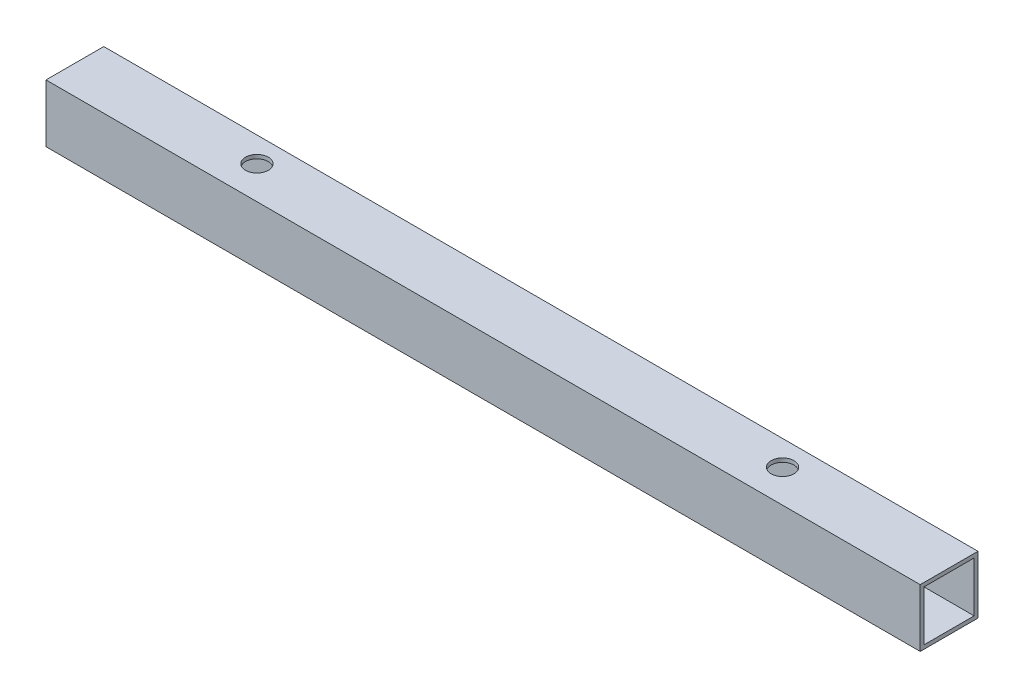
ISO-10303-21;
HEADER;
FILE_DESCRIPTION(('STEP AP214'),'2;1');
FILE_NAME('part.step','',(''),(''),'','','');
FILE_SCHEMA(('AUTOMOTIVE_DESIGN { 1 0 10303 214 1 1 1 1 }'));
ENDSEC;
DATA;
#1=APPLICATION_CONTEXT('core data for automotive mechanical design processes');
#2=APPLICATION_PROTOCOL_DEFINITION('international standard','automotive_design',2000,#1);
#3=PRODUCT_CONTEXT('',#1,'mechanical');
#4=PRODUCT('Part','Part','',(#3));
#5=PRODUCT_RELATED_PRODUCT_CATEGORY('part','',(#4));
#6=PRODUCT_DEFINITION_FORMATION('','',#4);
#7=PRODUCT_DEFINITION_CONTEXT('part definition',#1,'design');
#8=PRODUCT_DEFINITION('design','',#6,#7);
#9=PRODUCT_DEFINITION_SHAPE('','',#8);
#10=(LENGTH_UNIT() NAMED_UNIT(*) SI_UNIT(.MILLI.,.METRE.));
#11=(NAMED_UNIT(*) PLANE_ANGLE_UNIT() SI_UNIT($,.RADIAN.));
#12=(NAMED_UNIT(*) SI_UNIT($,.STERADIAN.) SOLID_ANGLE_UNIT());
#13=UNCERTAINTY_MEASURE_WITH_UNIT(LENGTH_MEASURE(1.E-05),#10,'distance_accuracy_value','');
#14=(GEOMETRIC_REPRESENTATION_CONTEXT(3) GLOBAL_UNCERTAINTY_ASSIGNED_CONTEXT((#13)) GLOBAL_UNIT_ASSIGNED_CONTEXT((#10,
#11,#12)) REPRESENTATION_CONTEXT('',''));
#15=CARTESIAN_POINT('',(0.,0.,0.));
#16=DIRECTION('',(0.,0.,1.));
#17=DIRECTION('',(1.,0.,0.));
#18=AXIS2_PLACEMENT_3D('',#15,#16,#17);
#19=CARTESIAN_POINT('',(0.,-12.7,0.));
#20=DIRECTION('',(0.,-1.,0.));
#21=DIRECTION('',(0.,0.,-1.));
#22=AXIS2_PLACEMENT_3D('',#19,#20,#21);
#23=PLANE('',#22);
#24=CARTESIAN_POINT('',(78.1498511893253,-12.7,10.9473999999996));
#25=DIRECTION('',(0.,-1.,0.));
#26=DIRECTION('',(0.,0.,-1.));
#27=AXIS2_PLACEMENT_3D('',#24,#25,#26);
#28=CIRCLE('',#27,5.01650000000001);
#29=CARTESIAN_POINT('',(78.1498511893253,-12.7,5.93089999999959));
#30=VERTEX_POINT('',#29);
#31=EDGE_CURVE('E100',#30,#30,#28,.F.);
#32=ORIENTED_EDGE('',*,*,#31,.T.);
#33=EDGE_LOOP('',(#32));
#34=FACE_BOUND('',#33,.T.);
#35=DIRECTION('',(1.,0.,0.));
#36=VECTOR('',#35,1.);
#37=CARTESIAN_POINT('',(0.,-12.7,0.));
#38=LINE('',#37,#36);
#39=CARTESIAN_POINT('',(0.,-12.7,0.));
#40=VERTEX_POINT('',#39);
#41=CARTESIAN_POINT('',(383.6725631,-12.7,0.));
#42=VERTEX_POINT('',#41);
#43=EDGE_CURVE('E123',#40,#42,#38,.T.);
#44=ORIENTED_EDGE('',*,*,#43,.T.);
#45=DIRECTION('',(0.,0.,1.));
#46=VECTOR('',#45,1.);
#47=CARTESIAN_POINT('',(383.6725631,-12.7,0.));
#48=LINE('',#47,#46);
#49=CARTESIAN_POINT('',(383.6725631,-12.7,25.3622376680039));
#50=VERTEX_POINT('',#49);
#51=EDGE_CURVE('E120',#42,#50,#48,.T.);
#52=ORIENTED_EDGE('',*,*,#51,.T.);
#53=DIRECTION('',(-1.,0.,0.));
#54=VECTOR('',#53,1.);
#55=CARTESIAN_POINT('',(387.6725631,-12.7,25.3622376680039));
#56=LINE('',#55,#54);
#57=CARTESIAN_POINT('',(0.,-12.7,25.3622376680038));
#58=VERTEX_POINT('',#57);
#59=EDGE_CURVE('E117',#50,#58,#56,.T.);
#60=ORIENTED_EDGE('',*,*,#59,.T.);
#61=DIRECTION('',(0.,0.,-1.));
#62=VECTOR('',#61,1.);
#63=CARTESIAN_POINT('',(0.,-12.7,0.));
#64=LINE('',#63,#62);
#65=EDGE_CURVE('E119',#58,#40,#64,.T.);
#66=ORIENTED_EDGE('',*,*,#65,.T.);
#67=EDGE_LOOP('',(#44,#52,#60,#66));
#68=FACE_BOUND('',#67,.T.);
#69=CARTESIAN_POINT('',(308.835299488687,-12.7,10.9473999999997));
#70=DIRECTION('',(0.,-1.,0.));
#71=DIRECTION('',(0.,0.,-1.));
#72=AXIS2_PLACEMENT_3D('',#69,#70,#71);
#73=CIRCLE('',#72,5.01650000000001);
#74=CARTESIAN_POINT('',(308.835299488687,-12.7,5.9308999999997));
#75=VERTEX_POINT('',#74);
#76=EDGE_CURVE('E155',#75,#75,#73,.F.);
#77=ORIENTED_EDGE('',*,*,#76,.T.);
#78=EDGE_LOOP('',(#77));
#79=FACE_BOUND('',#78,.T.);
#80=ADVANCED_FACE('F15',(#34,#68,#79),#23,.T.);
#81=CARTESIAN_POINT('',(0.,12.7,0.));
#82=DIRECTION('',(0.,-1.,0.));
#83=DIRECTION('',(0.,0.,-1.));
#84=AXIS2_PLACEMENT_3D('',#81,#82,#83);
#85=PLANE('',#84);
#86=CARTESIAN_POINT('',(78.1498511893253,12.7,10.9473999999996));
#87=DIRECTION('',(0.,-1.,0.));
#88=DIRECTION('',(1.,0.,0.));
#89=AXIS2_PLACEMENT_3D('',#86,#87,#88);
#90=CIRCLE('',#89,5.01650000000001);
#91=CARTESIAN_POINT('',(83.1663511893253,12.7,10.9473999999996));
#92=VERTEX_POINT('',#91);
#93=EDGE_CURVE('E148',#92,#92,#90,.T.);
#94=ORIENTED_EDGE('',*,*,#93,.T.);
#95=EDGE_LOOP('',(#94));
#96=FACE_BOUND('',#95,.T.);
#97=DIRECTION('',(1.,0.,0.));
#98=VECTOR('',#97,1.);
#99=CARTESIAN_POINT('',(0.,12.7,0.));
#100=LINE('',#99,#98);
#101=CARTESIAN_POINT('',(0.,12.7,0.));
#102=VERTEX_POINT('',#101);
#103=CARTESIAN_POINT('',(383.6725631,12.7,0.));
#104=VERTEX_POINT('',#103);
#105=EDGE_CURVE('E90',#102,#104,#100,.T.);
#106=ORIENTED_EDGE('',*,*,#105,.F.);
#107=DIRECTION('',(0.,0.,-1.));
#108=VECTOR('',#107,1.);
#109=CARTESIAN_POINT('',(0.,12.7,0.));
#110=LINE('',#109,#108);
#111=CARTESIAN_POINT('',(0.,12.7,25.3622376680038));
#112=VERTEX_POINT('',#111);
#113=EDGE_CURVE('E126',#112,#102,#110,.T.);
#114=ORIENTED_EDGE('',*,*,#113,.F.);
#115=DIRECTION('',(-1.,0.,0.));
#116=VECTOR('',#115,1.);
#117=CARTESIAN_POINT('',(387.6725631,12.7,25.3622376680039));
#118=LINE('',#117,#116);
#119=CARTESIAN_POINT('',(383.6725631,12.7,25.3622376680039));
#120=VERTEX_POINT('',#119);
#121=EDGE_CURVE('E127',#120,#112,#118,.T.);
#122=ORIENTED_EDGE('',*,*,#121,.F.);
#123=DIRECTION('',(0.,0.,1.));
#124=VECTOR('',#123,1.);
#125=CARTESIAN_POINT('',(383.6725631,12.7,0.));
#126=LINE('',#125,#124);
#127=EDGE_CURVE('E130',#104,#120,#126,.T.);
#128=ORIENTED_EDGE('',*,*,#127,.F.);
#129=EDGE_LOOP('',(#106,#114,#122,#128));
#130=FACE_BOUND('',#129,.T.);
#131=CARTESIAN_POINT('',(308.835299488687,12.7,10.9473999999997));
#132=DIRECTION('',(0.,-1.,0.));
#133=DIRECTION('',(1.,0.,0.));
#134=AXIS2_PLACEMENT_3D('',#131,#132,#133);
#135=CIRCLE('',#134,5.01650000000001);
#136=CARTESIAN_POINT('',(313.851799488687,12.7,10.9473999999997));
#137=VERTEX_POINT('',#136);
#138=EDGE_CURVE('E230',#137,#137,#135,.T.);
#139=ORIENTED_EDGE('',*,*,#138,.T.);
#140=EDGE_LOOP('',(#139));
#141=FACE_BOUND('',#140,.T.);
#142=ADVANCED_FACE('F193',(#96,#130,#141),#85,.F.);
#143=CARTESIAN_POINT('',(0.,-11.0109,0.));
#144=DIRECTION('',(0.,-1.,0.));
#145=DIRECTION('',(0.,0.,-1.));
#146=AXIS2_PLACEMENT_3D('',#143,#144,#145);
#147=PLANE('',#146);
#148=CARTESIAN_POINT('',(78.1498511893253,-11.0109,10.9473999999996));
#149=DIRECTION('',(0.,-1.,0.));
#150=DIRECTION('',(0.,0.,-1.));
#151=AXIS2_PLACEMENT_3D('',#148,#149,#150);
#152=CIRCLE('',#151,5.01650000000001);
#153=CARTESIAN_POINT('',(78.1498511893253,-11.0109,5.93089999999959));
#154=VERTEX_POINT('',#153);
#155=EDGE_CURVE('E147',#154,#154,#152,.F.);
#156=ORIENTED_EDGE('',*,*,#155,.F.);
#157=EDGE_LOOP('',(#156));
#158=FACE_BOUND('',#157,.T.);
#159=DIRECTION('',(1.,0.,0.));
#160=VECTOR('',#159,1.);
#161=CARTESIAN_POINT('',(0.,-11.0109,1.6891));
#162=LINE('',#161,#160);
#163=CARTESIAN_POINT('',(0.,-11.0109,1.6891));
#164=VERTEX_POINT('',#163);
#165=CARTESIAN_POINT('',(383.6725631,-11.0109,1.6891));
#166=VERTEX_POINT('',#165);
#167=EDGE_CURVE('E32',#164,#166,#162,.T.);
#168=ORIENTED_EDGE('',*,*,#167,.F.);
#169=DIRECTION('',(0.,0.,-1.));
#170=VECTOR('',#169,1.);
#171=CARTESIAN_POINT('',(0.,-11.0109,0.));
#172=LINE('',#171,#170);
#173=CARTESIAN_POINT('',(0.,-11.0109,23.6731376680038));
#174=VERTEX_POINT('',#173);
#175=EDGE_CURVE('E39',#174,#164,#172,.T.);
#176=ORIENTED_EDGE('',*,*,#175,.F.);
#177=DIRECTION('',(-1.,0.,0.));
#178=VECTOR('',#177,1.);
#179=CARTESIAN_POINT('',(387.6725631,-11.0109,23.6731376680039));
#180=LINE('',#179,#178);
#181=CARTESIAN_POINT('',(383.6725631,-11.0109,23.6731376680039));
#182=VERTEX_POINT('',#181);
#183=EDGE_CURVE('E112',#182,#174,#180,.T.);
#184=ORIENTED_EDGE('',*,*,#183,.F.);
#185=DIRECTION('',(0.,0.,1.));
#186=VECTOR('',#185,1.);
#187=CARTESIAN_POINT('',(383.6725631,-11.0109,0.));
#188=LINE('',#187,#186);
#189=EDGE_CURVE('E170',#166,#182,#188,.T.);
#190=ORIENTED_EDGE('',*,*,#189,.F.);
#191=EDGE_LOOP('',(#168,#176,#184,#190));
#192=FACE_BOUND('',#191,.T.);
#193=CARTESIAN_POINT('',(308.835299488687,-11.0109,10.9473999999997));
#194=DIRECTION('',(0.,-1.,0.));
#195=DIRECTION('',(0.,0.,-1.));
#196=AXIS2_PLACEMENT_3D('',#193,#194,#195);
#197=CIRCLE('',#196,5.01650000000001);
#198=CARTESIAN_POINT('',(308.835299488687,-11.0109,5.9308999999997));
#199=VERTEX_POINT('',#198);
#200=EDGE_CURVE('E163',#199,#199,#197,.F.);
#201=ORIENTED_EDGE('',*,*,#200,.F.);
#202=EDGE_LOOP('',(#201));
#203=FACE_BOUND('',#202,.T.);
#204=ADVANCED_FACE('F171',(#158,#192,#203),#147,.F.);
#205=CARTESIAN_POINT('',(0.,11.0109,0.));
#206=DIRECTION('',(0.,-1.,0.));
#207=DIRECTION('',(0.,0.,-1.));
#208=AXIS2_PLACEMENT_3D('',#205,#206,#207);
#209=PLANE('',#208);
#210=CARTESIAN_POINT('',(78.1498511893253,11.0109,10.9473999999996));
#211=DIRECTION('',(0.,-1.,0.));
#212=DIRECTION('',(0.,0.,-1.));
#213=AXIS2_PLACEMENT_3D('',#210,#211,#212);
#214=CIRCLE('',#213,5.01650000000001);
#215=CARTESIAN_POINT('',(78.1498511893253,11.0109,5.93089999999959));
#216=VERTEX_POINT('',#215);
#217=EDGE_CURVE('E145',#216,#216,#214,.F.);
#218=ORIENTED_EDGE('',*,*,#217,.T.);
#219=EDGE_LOOP('',(#218));
#220=FACE_BOUND('',#219,.T.);
#221=DIRECTION('',(1.,0.,0.));
#222=VECTOR('',#221,1.);
#223=CARTESIAN_POINT('',(0.,11.0109,1.6891));
#224=LINE('',#223,#222);
#225=CARTESIAN_POINT('',(0.,11.0109,1.6891));
#226=VERTEX_POINT('',#225);
#227=CARTESIAN_POINT('',(383.6725631,11.0109,1.6891));
#228=VERTEX_POINT('',#227);
#229=EDGE_CURVE('E85',#226,#228,#224,.T.);
#230=ORIENTED_EDGE('',*,*,#229,.T.);
#231=DIRECTION('',(0.,0.,1.));
#232=VECTOR('',#231,1.);
#233=CARTESIAN_POINT('',(383.6725631,11.0109,0.));
#234=LINE('',#233,#232);
#235=CARTESIAN_POINT('',(383.6725631,11.0109,23.6731376680039));
#236=VERTEX_POINT('',#235);
#237=EDGE_CURVE('E96',#228,#236,#234,.T.);
#238=ORIENTED_EDGE('',*,*,#237,.T.);
#239=DIRECTION('',(-1.,0.,0.));
#240=VECTOR('',#239,1.);
#241=CARTESIAN_POINT('',(387.6725631,11.0109,23.6731376680039));
#242=LINE('',#241,#240);
#243=CARTESIAN_POINT('',(0.,11.0109,23.6731376680038));
#244=VERTEX_POINT('',#243);
#245=EDGE_CURVE('E103',#236,#244,#242,.T.);
#246=ORIENTED_EDGE('',*,*,#245,.T.);
#247=DIRECTION('',(0.,0.,-1.));
#248=VECTOR('',#247,1.);
#249=CARTESIAN_POINT('',(0.,11.0109,0.));
#250=LINE('',#249,#248);
#251=EDGE_CURVE('E99',#244,#226,#250,.T.);
#252=ORIENTED_EDGE('',*,*,#251,.T.);
#253=EDGE_LOOP('',(#230,#238,#246,#252));
#254=FACE_BOUND('',#253,.T.);
#255=CARTESIAN_POINT('',(308.835299488687,11.0109,10.9473999999997));
#256=DIRECTION('',(0.,-1.,0.));
#257=DIRECTION('',(0.,0.,-1.));
#258=AXIS2_PLACEMENT_3D('',#255,#256,#257);
#259=CIRCLE('',#258,5.01650000000001);
#260=CARTESIAN_POINT('',(308.835299488687,11.0109,5.9308999999997));
#261=VERTEX_POINT('',#260);
#262=EDGE_CURVE('E19',#261,#261,#259,.F.);
#263=ORIENTED_EDGE('',*,*,#262,.T.);
#264=EDGE_LOOP('',(#263));
#265=FACE_BOUND('',#264,.T.);
#266=ADVANCED_FACE('F94',(#220,#254,#265),#209,.T.);
#267=CARTESIAN_POINT('',(383.6725631,-12.7,0.));
#268=DIRECTION('',(-1.,0.,0.));
#269=DIRECTION('',(0.,0.,1.));
#270=AXIS2_PLACEMENT_3D('',#267,#268,#269);
#271=PLANE('',#270);
#272=ORIENTED_EDGE('',*,*,#127,.T.);
#273=DIRECTION('',(0.,1.,0.));
#274=VECTOR('',#273,1.);
#275=CARTESIAN_POINT('',(383.6725631,-12.7,25.3622376680039));
#276=LINE('',#275,#274);
#277=EDGE_CURVE('E24',#50,#120,#276,.T.);
#278=ORIENTED_EDGE('',*,*,#277,.F.);
#279=ORIENTED_EDGE('',*,*,#51,.F.);
#280=DIRECTION('',(0.,1.,0.));
#281=VECTOR('',#280,1.);
#282=CARTESIAN_POINT('',(383.6725631,-12.7,0.));
#283=LINE('',#282,#281);
#284=EDGE_CURVE('E9',#42,#104,#283,.T.);
#285=ORIENTED_EDGE('',*,*,#284,.T.);
#286=EDGE_LOOP('',(#272,#278,#279,#285));
#287=FACE_BOUND('',#286,.T.);
#288=ORIENTED_EDGE('',*,*,#237,.F.);
#289=DIRECTION('',(0.,1.,0.));
#290=VECTOR('',#289,1.);
#291=CARTESIAN_POINT('',(383.6725631,-12.7,1.6891));
#292=LINE('',#291,#290);
#293=EDGE_CURVE('E82',#166,#228,#292,.T.);
#294=ORIENTED_EDGE('',*,*,#293,.F.);
#295=ORIENTED_EDGE('',*,*,#189,.T.);
#296=DIRECTION('',(0.,1.,0.));
#297=VECTOR('',#296,1.);
#298=CARTESIAN_POINT('',(383.6725631,-12.7,23.6731376680039));
#299=LINE('',#298,#297);
#300=EDGE_CURVE('E91',#182,#236,#299,.T.);
#301=ORIENTED_EDGE('',*,*,#300,.T.);
#302=EDGE_LOOP('',(#288,#294,#295,#301));
#303=FACE_BOUND('',#302,.T.);
#304=ADVANCED_FACE('F17',(#287,#303),#271,.F.);
#305=CARTESIAN_POINT('',(0.,-12.7,0.));
#306=DIRECTION('',(1.,0.,0.));
#307=DIRECTION('',(0.,0.,-1.));
#308=AXIS2_PLACEMENT_3D('',#305,#306,#307);
#309=PLANE('',#308);
#310=ORIENTED_EDGE('',*,*,#113,.T.);
#311=DIRECTION('',(0.,1.,0.));
#312=VECTOR('',#311,1.);
#313=CARTESIAN_POINT('',(0.,-12.7,0.));
#314=LINE('',#313,#312);
#315=EDGE_CURVE('E122',#40,#102,#314,.T.);
#316=ORIENTED_EDGE('',*,*,#315,.F.);
#317=ORIENTED_EDGE('',*,*,#65,.F.);
#318=DIRECTION('',(0.,1.,0.));
#319=VECTOR('',#318,1.);
#320=CARTESIAN_POINT('',(0.,-12.7,25.3622376680038));
#321=LINE('',#320,#319);
#322=EDGE_CURVE('E138',#58,#112,#321,.T.);
#323=ORIENTED_EDGE('',*,*,#322,.T.);
#324=EDGE_LOOP('',(#310,#316,#317,#323));
#325=FACE_BOUND('',#324,.T.);
#326=ORIENTED_EDGE('',*,*,#251,.F.);
#327=DIRECTION('',(0.,1.,0.));
#328=VECTOR('',#327,1.);
#329=CARTESIAN_POINT('',(0.,-12.7,23.6731376680038));
#330=LINE('',#329,#328);
#331=EDGE_CURVE('E109',#174,#244,#330,.T.);
#332=ORIENTED_EDGE('',*,*,#331,.F.);
#333=ORIENTED_EDGE('',*,*,#175,.T.);
#334=DIRECTION('',(0.,1.,0.));
#335=VECTOR('',#334,1.);
#336=CARTESIAN_POINT('',(0.,-12.7,1.6891));
#337=LINE('',#336,#335);
#338=EDGE_CURVE('E111',#164,#226,#337,.T.);
#339=ORIENTED_EDGE('',*,*,#338,.T.);
#340=EDGE_LOOP('',(#326,#332,#333,#339));
#341=FACE_BOUND('',#340,.T.);
#342=ADVANCED_FACE('F177',(#325,#341),#309,.F.);
#343=CARTESIAN_POINT('',(0.,-12.7,0.));
#344=DIRECTION('',(0.,0.,1.));
#345=DIRECTION('',(1.,0.,0.));
#346=AXIS2_PLACEMENT_3D('',#343,#344,#345);
#347=PLANE('',#346);
#348=ORIENTED_EDGE('',*,*,#105,.T.);
#349=ORIENTED_EDGE('',*,*,#284,.F.);
#350=ORIENTED_EDGE('',*,*,#43,.F.);
#351=ORIENTED_EDGE('',*,*,#315,.T.);
#352=EDGE_LOOP('',(#348,#349,#350,#351));
#353=FACE_BOUND('',#352,.T.);
#354=ADVANCED_FACE('F179',(#353),#347,.F.);
#355=CARTESIAN_POINT('',(387.6725631,-12.7,25.3622376680039));
#356=DIRECTION('',(0.,0.,-1.));
#357=DIRECTION('',(-1.,0.,0.));
#358=AXIS2_PLACEMENT_3D('',#355,#356,#357);
#359=PLANE('',#358);
#360=ORIENTED_EDGE('',*,*,#121,.T.);
#361=ORIENTED_EDGE('',*,*,#322,.F.);
#362=ORIENTED_EDGE('',*,*,#59,.F.);
#363=ORIENTED_EDGE('',*,*,#277,.T.);
#364=EDGE_LOOP('',(#360,#361,#362,#363));
#365=FACE_BOUND('',#364,.T.);
#366=ADVANCED_FACE('F187',(#365),#359,.F.);
#367=CARTESIAN_POINT('',(0.,-12.7,1.6891));
#368=DIRECTION('',(0.,0.,1.));
#369=DIRECTION('',(1.,0.,0.));
#370=AXIS2_PLACEMENT_3D('',#367,#368,#369);
#371=PLANE('',#370);
#372=ORIENTED_EDGE('',*,*,#229,.F.);
#373=ORIENTED_EDGE('',*,*,#338,.F.);
#374=ORIENTED_EDGE('',*,*,#167,.T.);
#375=ORIENTED_EDGE('',*,*,#293,.T.);
#376=EDGE_LOOP('',(#372,#373,#374,#375));
#377=FACE_BOUND('',#376,.T.);
#378=ADVANCED_FACE('F84',(#377),#371,.T.);
#379=CARTESIAN_POINT('',(387.6725631,-12.7,23.6731376680039));
#380=DIRECTION('',(0.,0.,-1.));
#381=DIRECTION('',(-1.,0.,0.));
#382=AXIS2_PLACEMENT_3D('',#379,#380,#381);
#383=PLANE('',#382);
#384=ORIENTED_EDGE('',*,*,#245,.F.);
#385=ORIENTED_EDGE('',*,*,#300,.F.);
#386=ORIENTED_EDGE('',*,*,#183,.T.);
#387=ORIENTED_EDGE('',*,*,#331,.T.);
#388=EDGE_LOOP('',(#384,#385,#386,#387));
#389=FACE_BOUND('',#388,.T.);
#390=ADVANCED_FACE('F175',(#389),#383,.T.);
#391=CARTESIAN_POINT('',(78.1498511893253,-18.9026802153172,10.9473999999996));
#392=DIRECTION('',(0.,1.,0.));
#393=DIRECTION('',(0.,0.,1.));
#394=AXIS2_PLACEMENT_3D('',#391,#392,#393);
#395=CYLINDRICAL_SURFACE('',#394,5.01650000000001);
#396=ORIENTED_EDGE('',*,*,#217,.F.);
#397=EDGE_LOOP('',(#396));
#398=FACE_BOUND('',#397,.T.);
#399=ORIENTED_EDGE('',*,*,#93,.F.);
#400=EDGE_LOOP('',(#399));
#401=FACE_BOUND('',#400,.T.);
#402=ADVANCED_FACE('F203',(#398,#401),#395,.F.);
#403=ORIENTED_EDGE('',*,*,#31,.F.);
#404=EDGE_LOOP('',(#403));
#405=FACE_BOUND('',#404,.T.);
#406=ORIENTED_EDGE('',*,*,#155,.T.);
#407=EDGE_LOOP('',(#406));
#408=FACE_BOUND('',#407,.T.);
#409=ADVANCED_FACE('F213',(#405,#408),#395,.F.);
#410=CARTESIAN_POINT('',(308.835299488687,-19.869866775961,10.9473999999997));
#411=DIRECTION('',(0.,1.,0.));
#412=DIRECTION('',(0.,0.,1.));
#413=AXIS2_PLACEMENT_3D('',#410,#411,#412);
#414=CYLINDRICAL_SURFACE('',#413,5.01650000000001);
#415=ORIENTED_EDGE('',*,*,#262,.F.);
#416=EDGE_LOOP('',(#415));
#417=FACE_BOUND('',#416,.T.);
#418=ORIENTED_EDGE('',*,*,#138,.F.);
#419=EDGE_LOOP('',(#418));
#420=FACE_BOUND('',#419,.T.);
#421=ADVANCED_FACE('F215',(#417,#420),#414,.F.);
#422=ORIENTED_EDGE('',*,*,#76,.F.);
#423=EDGE_LOOP('',(#422));
#424=FACE_BOUND('',#423,.T.);
#425=ORIENTED_EDGE('',*,*,#200,.T.);
#426=EDGE_LOOP('',(#425));
#427=FACE_BOUND('',#426,.T.);
#428=ADVANCED_FACE('F217',(#424,#427),#414,.F.);
#429=CLOSED_SHELL('',(#80,#142,#204,#266,#304,#342,#354,#366,#378,#390,#402,#409,#421,#428));
#430=MANIFOLD_SOLID_BREP('B1',#429);
#431=ADVANCED_BREP_SHAPE_REPRESENTATION('',(#18,#430),#14);
#432=SHAPE_DEFINITION_REPRESENTATION(#9,#431);
ENDSEC;
END-ISO-10303-21;
